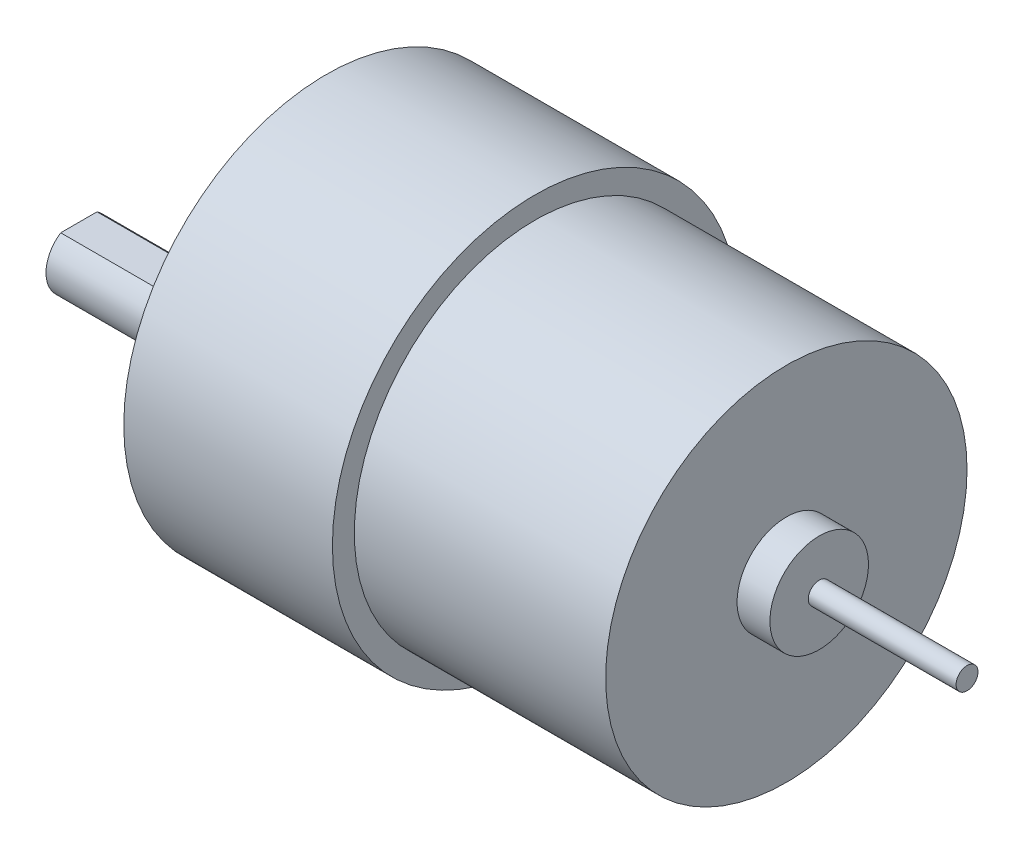
ISO-10303-21;
HEADER;
FILE_DESCRIPTION(('STEP AP214'),'2;1');
FILE_NAME('part.step','',(''),(''),'','','');
FILE_SCHEMA(('AUTOMOTIVE_DESIGN { 1 0 10303 214 1 1 1 1 }'));
ENDSEC;
DATA;
#1=APPLICATION_CONTEXT('core data for automotive mechanical design processes');
#2=APPLICATION_PROTOCOL_DEFINITION('international standard','automotive_design',2000,#1);
#3=PRODUCT_CONTEXT('',#1,'mechanical');
#4=PRODUCT('Part','Part','',(#3));
#5=PRODUCT_RELATED_PRODUCT_CATEGORY('part','',(#4));
#6=PRODUCT_DEFINITION_FORMATION('','',#4);
#7=PRODUCT_DEFINITION_CONTEXT('part definition',#1,'design');
#8=PRODUCT_DEFINITION('design','',#6,#7);
#9=PRODUCT_DEFINITION_SHAPE('','',#8);
#10=(LENGTH_UNIT() NAMED_UNIT(*) SI_UNIT(.MILLI.,.METRE.));
#11=(NAMED_UNIT(*) PLANE_ANGLE_UNIT() SI_UNIT($,.RADIAN.));
#12=(NAMED_UNIT(*) SI_UNIT($,.STERADIAN.) SOLID_ANGLE_UNIT());
#13=UNCERTAINTY_MEASURE_WITH_UNIT(LENGTH_MEASURE(1.E-05),#10,'distance_accuracy_value','');
#14=(GEOMETRIC_REPRESENTATION_CONTEXT(3) GLOBAL_UNCERTAINTY_ASSIGNED_CONTEXT((#13)) GLOBAL_UNIT_ASSIGNED_CONTEXT((#10,
#11,#12)) REPRESENTATION_CONTEXT('',''));
#15=CARTESIAN_POINT('',(0.,0.,0.));
#16=DIRECTION('',(0.,0.,1.));
#17=DIRECTION('',(1.,0.,0.));
#18=AXIS2_PLACEMENT_3D('',#15,#16,#17);
#19=CARTESIAN_POINT('',(19.05,0.,0.));
#20=DIRECTION('',(-1.,0.,0.));
#21=DIRECTION('',(0.,0.,1.));
#22=AXIS2_PLACEMENT_3D('',#19,#20,#21);
#23=CYLINDRICAL_SURFACE('',#22,18.5);
#24=CARTESIAN_POINT('',(19.05,0.,0.));
#25=DIRECTION('',(1.,0.,0.));
#26=DIRECTION('',(0.,0.,-1.));
#27=AXIS2_PLACEMENT_3D('',#24,#25,#26);
#28=CIRCLE('',#27,18.5);
#29=CARTESIAN_POINT('',(19.05,0.,18.5));
#30=VERTEX_POINT('',#29);
#31=EDGE_CURVE('E107',#30,#30,#28,.T.);
#32=CARTESIAN_POINT('',(0.,0.,0.));
#33=DIRECTION('',(1.,0.,0.));
#34=DIRECTION('',(0.,0.,-1.));
#35=AXIS2_PLACEMENT_3D('',#32,#33,#34);
#36=CIRCLE('',#35,18.5);
#37=CARTESIAN_POINT('',(0.,0.,18.5));
#38=VERTEX_POINT('',#37);
#39=EDGE_CURVE('E104',#38,#38,#36,.T.);
#40=CARTESIAN_POINT('',(19.05,0.,18.5));
#41=CARTESIAN_POINT('',(18.8515625,0.,18.5));
#42=CARTESIAN_POINT('',(18.653125,0.,18.5));
#43=CARTESIAN_POINT('',(18.25625,0.,18.5));
#44=CARTESIAN_POINT('',(18.0578125,0.,18.5));
#45=CARTESIAN_POINT('',(17.6609375,0.,18.5));
#46=CARTESIAN_POINT('',(17.4625,0.,18.5));
#47=CARTESIAN_POINT('',(17.065625,0.,18.5));
#48=CARTESIAN_POINT('',(16.8671875,0.,18.5));
#49=CARTESIAN_POINT('',(16.4703125,0.,18.5));
#50=CARTESIAN_POINT('',(16.271875,0.,18.5));
#51=CARTESIAN_POINT('',(15.875,0.,18.5));
#52=CARTESIAN_POINT('',(15.6765625,0.,18.5));
#53=CARTESIAN_POINT('',(15.2796875,0.,18.5));
#54=CARTESIAN_POINT('',(15.08125,0.,18.5));
#55=CARTESIAN_POINT('',(14.684375,0.,18.5));
#56=CARTESIAN_POINT('',(14.4859375,0.,18.5));
#57=CARTESIAN_POINT('',(14.0890625,0.,18.5));
#58=CARTESIAN_POINT('',(13.890625,0.,18.5));
#59=CARTESIAN_POINT('',(13.49375,0.,18.5));
#60=CARTESIAN_POINT('',(13.2953125,0.,18.5));
#61=CARTESIAN_POINT('',(12.8984375,0.,18.5));
#62=CARTESIAN_POINT('',(12.7,0.,18.5));
#63=CARTESIAN_POINT('',(12.303125,0.,18.5));
#64=CARTESIAN_POINT('',(12.1046875,0.,18.5));
#65=CARTESIAN_POINT('',(11.7078125,0.,18.5));
#66=CARTESIAN_POINT('',(11.509375,0.,18.5));
#67=CARTESIAN_POINT('',(11.1125,0.,18.5));
#68=CARTESIAN_POINT('',(10.9140625,0.,18.5));
#69=CARTESIAN_POINT('',(10.5171875,0.,18.5));
#70=CARTESIAN_POINT('',(10.31875,0.,18.5));
#71=CARTESIAN_POINT('',(9.921875,0.,18.5));
#72=CARTESIAN_POINT('',(9.7234375,0.,18.5));
#73=CARTESIAN_POINT('',(9.3265625,0.,18.5));
#74=CARTESIAN_POINT('',(9.128125,0.,18.5));
#75=CARTESIAN_POINT('',(8.73125,0.,18.5));
#76=CARTESIAN_POINT('',(8.5328125,0.,18.5));
#77=CARTESIAN_POINT('',(8.1359375,0.,18.5));
#78=CARTESIAN_POINT('',(7.9375,0.,18.5));
#79=CARTESIAN_POINT('',(7.540625,0.,18.5));
#80=CARTESIAN_POINT('',(7.3421875,0.,18.5));
#81=CARTESIAN_POINT('',(6.9453125,0.,18.5));
#82=CARTESIAN_POINT('',(6.746875,0.,18.5));
#83=CARTESIAN_POINT('',(6.35,0.,18.5));
#84=CARTESIAN_POINT('',(6.1515625,0.,18.5));
#85=CARTESIAN_POINT('',(5.7546875,0.,18.5));
#86=CARTESIAN_POINT('',(5.55625,0.,18.5));
#87=CARTESIAN_POINT('',(5.159375,0.,18.5));
#88=CARTESIAN_POINT('',(4.9609375,0.,18.5));
#89=CARTESIAN_POINT('',(4.5640625,0.,18.5));
#90=CARTESIAN_POINT('',(4.365625,0.,18.5));
#91=CARTESIAN_POINT('',(3.96875,0.,18.5));
#92=CARTESIAN_POINT('',(3.7703125,0.,18.5));
#93=CARTESIAN_POINT('',(3.3734375,0.,18.5));
#94=CARTESIAN_POINT('',(3.175,0.,18.5));
#95=CARTESIAN_POINT('',(2.778125,0.,18.5));
#96=CARTESIAN_POINT('',(2.5796875,0.,18.5));
#97=CARTESIAN_POINT('',(2.1828125,0.,18.5));
#98=CARTESIAN_POINT('',(1.984375,0.,18.5));
#99=CARTESIAN_POINT('',(1.5875,0.,18.5));
#100=CARTESIAN_POINT('',(1.3890625,0.,18.5));
#101=CARTESIAN_POINT('',(0.992187500000001,0.,18.5));
#102=CARTESIAN_POINT('',(0.793750000000001,0.,18.5));
#103=CARTESIAN_POINT('',(0.396875,0.,18.5));
#104=CARTESIAN_POINT('',(0.1984375,0.,18.5));
#105=CARTESIAN_POINT('',(0.,0.,18.5));
#106=B_SPLINE_CURVE_WITH_KNOTS('',3,(#40,#41,#42,#43,#44,#45,#46,#47,#48,#49,#50,#51,#52,#53,
#54,#55,#56,#57,#58,#59,#60,#61,#62,#63,#64,#65,#66,#67,#68,#69,#70,#71,#72,#73,#74,#75,#76,#77,
#78,#79,#80,#81,#82,#83,#84,#85,#86,#87,#88,#89,#90,#91,#92,#93,#94,#95,#96,#97,#98,#99,#100,
#101,#102,#103,#104,#105),.UNSPECIFIED.,.F.,.F.,(4,2,2,2,2,2,2,2,2,2,2,2,2,2,2,2,2,2,2,2,2,2,2,
2,2,2,2,2,2,2,2,2,4),(0.,0.595312499999997,1.190625,1.7859375,2.38125,2.9765625,3.571875,
4.1671875,4.7625,5.3578125,5.953125,6.5484375,7.14375,7.7390625,8.334375,8.9296875,9.525,
10.1203125,10.715625,11.3109375,11.90625,12.5015625,13.096875,13.6921875,14.2875,14.8828125,
15.478125,16.0734375,16.66875,17.2640625,17.859375,18.4546875,19.05),.UNSPECIFIED.);
#107=EDGE_CURVE('BSEAM39',#30,#38,#106,.T.);
#108=ORIENTED_EDGE('',*,*,#31,.F.);
#109=ORIENTED_EDGE('',*,*,#39,.T.);
#110=ORIENTED_EDGE('',*,*,#107,.T.);
#111=ORIENTED_EDGE('',*,*,#107,.F.);
#112=EDGE_LOOP('',(#108,#110,#109,#111));
#113=FACE_BOUND('',#112,.T.);
#114=ADVANCED_FACE('F39',(#113),#23,.T.);
#115=CARTESIAN_POINT('',(19.05,0.,0.));
#116=DIRECTION('',(1.,0.,0.));
#117=DIRECTION('',(0.,0.,-1.));
#118=AXIS2_PLACEMENT_3D('',#115,#116,#117);
#119=PLANE('',#118);
#120=CARTESIAN_POINT('',(19.05,0.,0.));
#121=DIRECTION('',(1.,0.,0.));
#122=DIRECTION('',(0.,0.,-1.));
#123=AXIS2_PLACEMENT_3D('',#120,#121,#122);
#124=CIRCLE('',#123,16.5);
#125=CARTESIAN_POINT('',(19.05,0.,-16.5));
#126=VERTEX_POINT('',#125);
#127=EDGE_CURVE('E101',#126,#126,#124,.T.);
#128=ORIENTED_EDGE('',*,*,#127,.F.);
#129=EDGE_LOOP('',(#128));
#130=FACE_BOUND('',#129,.T.);
#131=ORIENTED_EDGE('',*,*,#31,.T.);
#132=EDGE_LOOP('',(#131));
#133=FACE_BOUND('',#132,.T.);
#134=ADVANCED_FACE('F116',(#130,#133),#119,.T.);
#135=CARTESIAN_POINT('',(0.,0.,0.));
#136=DIRECTION('',(1.,0.,0.));
#137=DIRECTION('',(0.,0.,-1.));
#138=AXIS2_PLACEMENT_3D('',#135,#136,#137);
#139=PLANE('',#138);
#140=CARTESIAN_POINT('',(0.,-7.,0.));
#141=DIRECTION('',(1.,0.,0.));
#142=DIRECTION('',(0.,0.,-1.));
#143=AXIS2_PLACEMENT_3D('',#140,#141,#142);
#144=CIRCLE('',#143,6.);
#145=CARTESIAN_POINT('',(0.,-7.,-6.));
#146=VERTEX_POINT('',#145);
#147=EDGE_CURVE('E42',#146,#146,#144,.F.);
#148=ORIENTED_EDGE('',*,*,#147,.F.);
#149=EDGE_LOOP('',(#148));
#150=FACE_BOUND('',#149,.T.);
#151=ORIENTED_EDGE('',*,*,#39,.F.);
#152=EDGE_LOOP('',(#151));
#153=FACE_BOUND('',#152,.T.);
#154=ADVANCED_FACE('F113',(#150,#153),#139,.F.);
#155=CARTESIAN_POINT('',(42.,0.,0.));
#156=DIRECTION('',(-1.,0.,0.));
#157=DIRECTION('',(0.,0.,1.));
#158=AXIS2_PLACEMENT_3D('',#155,#156,#157);
#159=CYLINDRICAL_SURFACE('',#158,16.5);
#160=CARTESIAN_POINT('',(42.,0.,0.));
#161=DIRECTION('',(1.,0.,0.));
#162=DIRECTION('',(0.,0.,-1.));
#163=AXIS2_PLACEMENT_3D('',#160,#161,#162);
#164=CIRCLE('',#163,16.5);
#165=CARTESIAN_POINT('',(42.,0.,-16.5));
#166=VERTEX_POINT('',#165);
#167=EDGE_CURVE('E98',#166,#166,#164,.T.);
#168=ORIENTED_EDGE('',*,*,#167,.F.);
#169=EDGE_LOOP('',(#168));
#170=FACE_BOUND('',#169,.T.);
#171=ORIENTED_EDGE('',*,*,#127,.T.);
#172=EDGE_LOOP('',(#171));
#173=FACE_BOUND('',#172,.T.);
#174=ADVANCED_FACE('F115',(#170,#173),#159,.T.);
#175=CARTESIAN_POINT('',(42.,0.,0.));
#176=DIRECTION('',(1.,0.,0.));
#177=DIRECTION('',(0.,0.,-1.));
#178=AXIS2_PLACEMENT_3D('',#175,#176,#177);
#179=PLANE('',#178);
#180=CARTESIAN_POINT('',(42.,0.,0.));
#181=DIRECTION('',(1.,0.,0.));
#182=DIRECTION('',(0.,0.,-1.));
#183=AXIS2_PLACEMENT_3D('',#180,#181,#182);
#184=CIRCLE('',#183,4.5);
#185=CARTESIAN_POINT('',(42.,0.,-4.5));
#186=VERTEX_POINT('',#185);
#187=EDGE_CURVE('E95',#186,#186,#184,.T.);
#188=ORIENTED_EDGE('',*,*,#187,.F.);
#189=EDGE_LOOP('',(#188));
#190=FACE_BOUND('',#189,.T.);
#191=ORIENTED_EDGE('',*,*,#167,.T.);
#192=EDGE_LOOP('',(#191));
#193=FACE_BOUND('',#192,.T.);
#194=ADVANCED_FACE('F123',(#190,#193),#179,.T.);
#195=CARTESIAN_POINT('',(45.,0.,0.));
#196=DIRECTION('',(-1.,0.,0.));
#197=DIRECTION('',(0.,0.,1.));
#198=AXIS2_PLACEMENT_3D('',#195,#196,#197);
#199=CYLINDRICAL_SURFACE('',#198,4.5);
#200=CARTESIAN_POINT('',(45.,0.,0.));
#201=DIRECTION('',(1.,0.,0.));
#202=DIRECTION('',(0.,0.,-1.));
#203=AXIS2_PLACEMENT_3D('',#200,#201,#202);
#204=CIRCLE('',#203,4.5);
#205=CARTESIAN_POINT('',(45.,0.,-4.5));
#206=VERTEX_POINT('',#205);
#207=EDGE_CURVE('E91',#206,#206,#204,.T.);
#208=ORIENTED_EDGE('',*,*,#207,.F.);
#209=EDGE_LOOP('',(#208));
#210=FACE_BOUND('',#209,.T.);
#211=ORIENTED_EDGE('',*,*,#187,.T.);
#212=EDGE_LOOP('',(#211));
#213=FACE_BOUND('',#212,.T.);
#214=ADVANCED_FACE('F153',(#210,#213),#199,.T.);
#215=CARTESIAN_POINT('',(45.,0.,0.));
#216=DIRECTION('',(1.,0.,0.));
#217=DIRECTION('',(0.,0.,-1.));
#218=AXIS2_PLACEMENT_3D('',#215,#216,#217);
#219=PLANE('',#218);
#220=CARTESIAN_POINT('',(45.,0.,0.));
#221=DIRECTION('',(1.,0.,0.));
#222=DIRECTION('',(0.,0.,-1.));
#223=AXIS2_PLACEMENT_3D('',#220,#221,#222);
#224=CIRCLE('',#223,1.);
#225=CARTESIAN_POINT('',(45.,0.,-1.));
#226=VERTEX_POINT('',#225);
#227=EDGE_CURVE('E92',#226,#226,#224,.T.);
#228=ORIENTED_EDGE('',*,*,#227,.F.);
#229=EDGE_LOOP('',(#228));
#230=FACE_BOUND('',#229,.T.);
#231=ORIENTED_EDGE('',*,*,#207,.T.);
#232=EDGE_LOOP('',(#231));
#233=FACE_BOUND('',#232,.T.);
#234=ADVANCED_FACE('F162',(#230,#233),#219,.T.);
#235=CARTESIAN_POINT('',(58.5,0.,0.));
#236=DIRECTION('',(-1.,0.,0.));
#237=DIRECTION('',(0.,0.,1.));
#238=AXIS2_PLACEMENT_3D('',#235,#236,#237);
#239=CYLINDRICAL_SURFACE('',#238,1.);
#240=CARTESIAN_POINT('',(58.5,0.,0.));
#241=DIRECTION('',(1.,0.,0.));
#242=DIRECTION('',(0.,0.,-1.));
#243=AXIS2_PLACEMENT_3D('',#240,#241,#242);
#244=CIRCLE('',#243,1.);
#245=CARTESIAN_POINT('',(58.5,0.,-1.));
#246=VERTEX_POINT('',#245);
#247=EDGE_CURVE('E88',#246,#246,#244,.T.);
#248=ORIENTED_EDGE('',*,*,#247,.F.);
#249=EDGE_LOOP('',(#248));
#250=FACE_BOUND('',#249,.T.);
#251=ORIENTED_EDGE('',*,*,#227,.T.);
#252=EDGE_LOOP('',(#251));
#253=FACE_BOUND('',#252,.T.);
#254=ADVANCED_FACE('F171',(#250,#253),#239,.T.);
#255=CARTESIAN_POINT('',(58.5,0.,0.));
#256=DIRECTION('',(1.,0.,0.));
#257=DIRECTION('',(0.,0.,-1.));
#258=AXIS2_PLACEMENT_3D('',#255,#256,#257);
#259=PLANE('',#258);
#260=ORIENTED_EDGE('',*,*,#247,.T.);
#261=EDGE_LOOP('',(#260));
#262=FACE_BOUND('',#261,.T.);
#263=ADVANCED_FACE('F179',(#262),#259,.T.);
#264=CARTESIAN_POINT('',(-4.6,-7.,0.));
#265=DIRECTION('',(1.,0.,0.));
#266=DIRECTION('',(0.,0.,-1.));
#267=AXIS2_PLACEMENT_3D('',#264,#265,#266);
#268=CYLINDRICAL_SURFACE('',#267,6.);
#269=CARTESIAN_POINT('',(-4.6,-7.,0.));
#270=DIRECTION('',(-1.,0.,0.));
#271=DIRECTION('',(0.,0.,1.));
#272=AXIS2_PLACEMENT_3D('',#269,#270,#271);
#273=CIRCLE('',#272,6.);
#274=CARTESIAN_POINT('',(-4.6,-7.,6.));
#275=VERTEX_POINT('',#274);
#276=EDGE_CURVE('E71',#275,#275,#273,.T.);
#277=ORIENTED_EDGE('',*,*,#276,.F.);
#278=EDGE_LOOP('',(#277));
#279=FACE_BOUND('',#278,.T.);
#280=ORIENTED_EDGE('',*,*,#147,.T.);
#281=EDGE_LOOP('',(#280));
#282=FACE_BOUND('',#281,.T.);
#283=ADVANCED_FACE('F187',(#279,#282),#268,.T.);
#284=CARTESIAN_POINT('',(-4.6,-7.,0.));
#285=DIRECTION('',(-1.,0.,0.));
#286=DIRECTION('',(0.,0.,1.));
#287=AXIS2_PLACEMENT_3D('',#284,#285,#286);
#288=PLANE('',#287);
#289=CARTESIAN_POINT('',(-4.6,-7.,0.));
#290=DIRECTION('',(-1.,0.,0.));
#291=DIRECTION('',(0.,0.,1.));
#292=AXIS2_PLACEMENT_3D('',#289,#290,#291);
#293=CIRCLE('',#292,3.);
#294=CARTESIAN_POINT('',(-4.6,-7.,3.));
#295=VERTEX_POINT('',#294);
#296=EDGE_CURVE('E11',#295,#295,#293,.T.);
#297=ORIENTED_EDGE('',*,*,#296,.F.);
#298=EDGE_LOOP('',(#297));
#299=FACE_BOUND('',#298,.T.);
#300=ORIENTED_EDGE('',*,*,#276,.T.);
#301=EDGE_LOOP('',(#300));
#302=FACE_BOUND('',#301,.T.);
#303=ADVANCED_FACE('F199',(#299,#302),#288,.T.);
#304=CARTESIAN_POINT('',(-10.6,-7.,0.));
#305=DIRECTION('',(1.,0.,0.));
#306=DIRECTION('',(0.,0.,-1.));
#307=AXIS2_PLACEMENT_3D('',#304,#305,#306);
#308=CYLINDRICAL_SURFACE('',#307,3.);
#309=CARTESIAN_POINT('',(-10.6,-7.,0.));
#310=DIRECTION('',(-1.,0.,0.));
#311=DIRECTION('',(0.,0.,1.));
#312=AXIS2_PLACEMENT_3D('',#309,#310,#311);
#313=CIRCLE('',#312,3.);
#314=CARTESIAN_POINT('',(-10.6,-4.5,1.6583123951777));
#315=VERTEX_POINT('',#314);
#316=CARTESIAN_POINT('',(-10.6,-4.5,-1.6583123951777));
#317=VERTEX_POINT('',#316);
#318=EDGE_CURVE('E65',#315,#317,#313,.T.);
#319=ORIENTED_EDGE('',*,*,#318,.F.);
#320=DIRECTION('',(1.,0.,0.));
#321=VECTOR('',#320,1.);
#322=CARTESIAN_POINT('',(-22.6,-4.5,1.6583123951777));
#323=LINE('',#322,#321);
#324=CARTESIAN_POINT('',(-22.6,-4.5,1.6583123951777));
#325=VERTEX_POINT('',#324);
#326=EDGE_CURVE('E72',#325,#315,#323,.T.);
#327=ORIENTED_EDGE('',*,*,#326,.F.);
#328=CARTESIAN_POINT('',(-22.6,-7.,0.));
#329=DIRECTION('',(-1.,0.,0.));
#330=DIRECTION('',(0.,0.,1.));
#331=AXIS2_PLACEMENT_3D('',#328,#329,#330);
#332=CIRCLE('',#331,3.);
#333=CARTESIAN_POINT('',(-22.6,-4.5,-1.6583123951777));
#334=VERTEX_POINT('',#333);
#335=EDGE_CURVE('E78',#334,#325,#332,.T.);
#336=ORIENTED_EDGE('',*,*,#335,.F.);
#337=DIRECTION('',(1.,0.,0.));
#338=VECTOR('',#337,1.);
#339=CARTESIAN_POINT('',(-22.6,-4.5,-1.6583123951777));
#340=LINE('',#339,#338);
#341=EDGE_CURVE('E76',#334,#317,#340,.T.);
#342=ORIENTED_EDGE('',*,*,#341,.T.);
#343=EDGE_LOOP('',(#319,#327,#336,#342));
#344=FACE_BOUND('',#343,.T.);
#345=ORIENTED_EDGE('',*,*,#296,.T.);
#346=EDGE_LOOP('',(#345));
#347=FACE_BOUND('',#346,.T.);
#348=ADVANCED_FACE('F80',(#344,#347),#308,.T.);
#349=CARTESIAN_POINT('',(-10.6,-7.,0.));
#350=DIRECTION('',(-1.,0.,0.));
#351=DIRECTION('',(0.,0.,1.));
#352=AXIS2_PLACEMENT_3D('',#349,#350,#351);
#353=PLANE('',#352);
#354=DIRECTION('',(0.,0.,-1.));
#355=VECTOR('',#354,1.);
#356=CARTESIAN_POINT('',(-10.6,-4.5,-1.6583123951777));
#357=LINE('',#356,#355);
#358=EDGE_CURVE('E53',#315,#317,#357,.T.);
#359=ORIENTED_EDGE('',*,*,#358,.F.);
#360=ORIENTED_EDGE('',*,*,#318,.T.);
#361=EDGE_LOOP('',(#359,#360));
#362=FACE_BOUND('',#361,.T.);
#363=ADVANCED_FACE('F66',(#362),#353,.T.);
#364=CARTESIAN_POINT('',(-22.6,-4.5,-1.6583123951777));
#365=DIRECTION('',(0.,-1.,0.));
#366=DIRECTION('',(0.,0.,-1.));
#367=AXIS2_PLACEMENT_3D('',#364,#365,#366);
#368=PLANE('',#367);
#369=ORIENTED_EDGE('',*,*,#358,.T.);
#370=ORIENTED_EDGE('',*,*,#341,.F.);
#371=DIRECTION('',(0.,0.,-1.));
#372=VECTOR('',#371,1.);
#373=CARTESIAN_POINT('',(-22.6,-4.5,-1.6583123951777));
#374=LINE('',#373,#372);
#375=EDGE_CURVE('E61',#325,#334,#374,.T.);
#376=ORIENTED_EDGE('',*,*,#375,.F.);
#377=ORIENTED_EDGE('',*,*,#326,.T.);
#378=EDGE_LOOP('',(#369,#370,#376,#377));
#379=FACE_BOUND('',#378,.T.);
#380=ADVANCED_FACE('F75',(#379),#368,.F.);
#381=CARTESIAN_POINT('',(-22.6,-7.,0.));
#382=DIRECTION('',(-1.,0.,0.));
#383=DIRECTION('',(0.,0.,1.));
#384=AXIS2_PLACEMENT_3D('',#381,#382,#383);
#385=PLANE('',#384);
#386=ORIENTED_EDGE('',*,*,#335,.T.);
#387=ORIENTED_EDGE('',*,*,#375,.T.);
#388=EDGE_LOOP('',(#386,#387));
#389=FACE_BOUND('',#388,.T.);
#390=ADVANCED_FACE('F236',(#389),#385,.T.);
#391=CLOSED_SHELL('',(#114,#134,#154,#174,#194,#214,#234,#254,#263,#283,#303,#348,#363,#380,#390));
#392=MANIFOLD_SOLID_BREP('B2',#391);
#393=ADVANCED_BREP_SHAPE_REPRESENTATION('',(#18,#392),#14);
#394=SHAPE_DEFINITION_REPRESENTATION(#9,#393);
ENDSEC;
END-ISO-10303-21;
